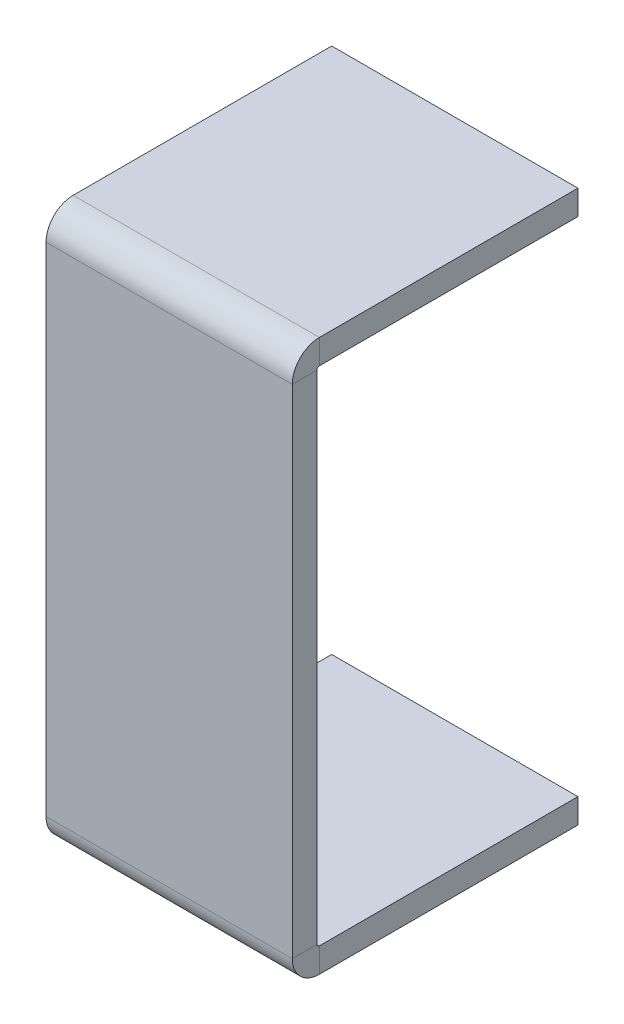
ISO-10303-21;
HEADER;
FILE_DESCRIPTION(('STEP AP214'),'2;1');
FILE_NAME('part.step','',(''),(''),'','','');
FILE_SCHEMA(('AUTOMOTIVE_DESIGN { 1 0 10303 214 1 1 1 1 }'));
ENDSEC;
DATA;
#1=APPLICATION_CONTEXT('core data for automotive mechanical design processes');
#2=APPLICATION_PROTOCOL_DEFINITION('international standard','automotive_design',2000,#1);
#3=PRODUCT_CONTEXT('',#1,'mechanical');
#4=PRODUCT('Part','Part','',(#3));
#5=PRODUCT_RELATED_PRODUCT_CATEGORY('part','',(#4));
#6=PRODUCT_DEFINITION_FORMATION('','',#4);
#7=PRODUCT_DEFINITION_CONTEXT('part definition',#1,'design');
#8=PRODUCT_DEFINITION('design','',#6,#7);
#9=PRODUCT_DEFINITION_SHAPE('','',#8);
#10=(LENGTH_UNIT() NAMED_UNIT(*) SI_UNIT(.MILLI.,.METRE.));
#11=(NAMED_UNIT(*) PLANE_ANGLE_UNIT() SI_UNIT($,.RADIAN.));
#12=(NAMED_UNIT(*) SI_UNIT($,.STERADIAN.) SOLID_ANGLE_UNIT());
#13=UNCERTAINTY_MEASURE_WITH_UNIT(LENGTH_MEASURE(1.E-05),#10,'distance_accuracy_value','');
#14=(GEOMETRIC_REPRESENTATION_CONTEXT(3) GLOBAL_UNCERTAINTY_ASSIGNED_CONTEXT((#13)) GLOBAL_UNIT_ASSIGNED_CONTEXT((#10,
#11,#12)) REPRESENTATION_CONTEXT('',''));
#15=CARTESIAN_POINT('',(0.,0.,0.));
#16=DIRECTION('',(0.,0.,1.));
#17=DIRECTION('',(1.,0.,0.));
#18=AXIS2_PLACEMENT_3D('',#15,#16,#17);
#19=CARTESIAN_POINT('',(0.,0.,-10.));
#20=DIRECTION('',(0.,0.,1.));
#21=DIRECTION('',(1.,0.,0.));
#22=AXIS2_PLACEMENT_3D('',#19,#20,#21);
#23=PLANE('',#22);
#24=DIRECTION('',(-1.,0.,0.));
#25=VECTOR('',#24,1.);
#26=CARTESIAN_POINT('',(-50.,-101.,-10.));
#27=LINE('',#26,#25);
#28=CARTESIAN_POINT('',(-50.,-101.,-10.));
#29=VERTEX_POINT('',#28);
#30=CARTESIAN_POINT('',(50.,-101.,-10.));
#31=VERTEX_POINT('',#30);
#32=EDGE_CURVE('E225',#29,#31,#27,.F.);
#33=ORIENTED_EDGE('',*,*,#32,.F.);
#34=DIRECTION('',(0.,-1.,0.));
#35=VECTOR('',#34,1.);
#36=CARTESIAN_POINT('',(-50.,112.,-10.));
#37=LINE('',#36,#35);
#38=CARTESIAN_POINT('',(-50.,101.,-10.));
#39=VERTEX_POINT('',#38);
#40=EDGE_CURVE('E13',#39,#29,#37,.T.);
#41=ORIENTED_EDGE('',*,*,#40,.F.);
#42=DIRECTION('',(1.,0.,0.));
#43=VECTOR('',#42,1.);
#44=CARTESIAN_POINT('',(50.,101.,-10.));
#45=LINE('',#44,#43);
#46=CARTESIAN_POINT('',(50.,101.,-10.));
#47=VERTEX_POINT('',#46);
#48=EDGE_CURVE('E277',#47,#39,#45,.F.);
#49=ORIENTED_EDGE('',*,*,#48,.F.);
#50=DIRECTION('',(0.,1.,0.));
#51=VECTOR('',#50,1.);
#52=CARTESIAN_POINT('',(50.,112.,-10.));
#53=LINE('',#52,#51);
#54=EDGE_CURVE('E88',#31,#47,#53,.T.);
#55=ORIENTED_EDGE('',*,*,#54,.F.);
#56=EDGE_LOOP('',(#33,#41,#49,#55));
#57=FACE_BOUND('',#56,.T.);
#58=ADVANCED_FACE('F79',(#57),#23,.F.);
#59=CARTESIAN_POINT('',(0.,0.,0.));
#60=DIRECTION('',(0.,0.,1.));
#61=DIRECTION('',(1.,0.,0.));
#62=AXIS2_PLACEMENT_3D('',#59,#60,#61);
#63=PLANE('',#62);
#64=DIRECTION('',(0.,-1.,0.));
#65=VECTOR('',#64,1.);
#66=CARTESIAN_POINT('',(-50.,112.,0.));
#67=LINE('',#66,#65);
#68=CARTESIAN_POINT('',(-50.,101.,0.));
#69=VERTEX_POINT('',#68);
#70=CARTESIAN_POINT('',(-50.,-101.,0.));
#71=VERTEX_POINT('',#70);
#72=EDGE_CURVE('E83',#69,#71,#67,.T.);
#73=ORIENTED_EDGE('',*,*,#72,.T.);
#74=DIRECTION('',(-1.,0.,0.));
#75=VECTOR('',#74,1.);
#76=CARTESIAN_POINT('',(-50.,-101.,0.));
#77=LINE('',#76,#75);
#78=CARTESIAN_POINT('',(50.,-101.,0.));
#79=VERTEX_POINT('',#78);
#80=EDGE_CURVE('E214',#71,#79,#77,.F.);
#81=ORIENTED_EDGE('',*,*,#80,.T.);
#82=DIRECTION('',(0.,1.,0.));
#83=VECTOR('',#82,1.);
#84=CARTESIAN_POINT('',(50.,112.,0.));
#85=LINE('',#84,#83);
#86=CARTESIAN_POINT('',(50.,101.,0.));
#87=VERTEX_POINT('',#86);
#88=EDGE_CURVE('E283',#79,#87,#85,.T.);
#89=ORIENTED_EDGE('',*,*,#88,.T.);
#90=DIRECTION('',(1.,0.,0.));
#91=VECTOR('',#90,1.);
#92=CARTESIAN_POINT('',(50.,101.,0.));
#93=LINE('',#92,#91);
#94=EDGE_CURVE('E266',#87,#69,#93,.F.);
#95=ORIENTED_EDGE('',*,*,#94,.T.);
#96=EDGE_LOOP('',(#73,#81,#89,#95));
#97=FACE_BOUND('',#96,.T.);
#98=ADVANCED_FACE('F292',(#97),#63,.T.);
#99=CARTESIAN_POINT('',(-50.,112.,-10.));
#100=DIRECTION('',(-1.,0.,0.));
#101=DIRECTION('',(0.,-1.,0.));
#102=AXIS2_PLACEMENT_3D('',#99,#100,#101);
#103=PLANE('',#102);
#104=ORIENTED_EDGE('',*,*,#40,.T.);
#105=DIRECTION('',(0.,0.,1.));
#106=VECTOR('',#105,1.);
#107=CARTESIAN_POINT('',(-50.,-101.,-10.));
#108=LINE('',#107,#106);
#109=EDGE_CURVE('E219',#29,#71,#108,.T.);
#110=ORIENTED_EDGE('',*,*,#109,.T.);
#111=ORIENTED_EDGE('',*,*,#72,.F.);
#112=DIRECTION('',(0.,0.,1.));
#113=VECTOR('',#112,1.);
#114=CARTESIAN_POINT('',(-50.,101.,-10.));
#115=LINE('',#114,#113);
#116=EDGE_CURVE('E281',#39,#69,#115,.T.);
#117=ORIENTED_EDGE('',*,*,#116,.F.);
#118=EDGE_LOOP('',(#104,#110,#111,#117));
#119=FACE_BOUND('',#118,.T.);
#120=ADVANCED_FACE('F295',(#119),#103,.T.);
#121=CARTESIAN_POINT('',(50.,112.,-10.));
#122=DIRECTION('',(1.,0.,0.));
#123=DIRECTION('',(0.,1.,0.));
#124=AXIS2_PLACEMENT_3D('',#121,#122,#123);
#125=PLANE('',#124);
#126=DIRECTION('',(0.,0.,1.));
#127=VECTOR('',#126,1.);
#128=CARTESIAN_POINT('',(50.,-101.,-10.));
#129=LINE('',#128,#127);
#130=EDGE_CURVE('E229',#31,#79,#129,.T.);
#131=ORIENTED_EDGE('',*,*,#130,.F.);
#132=ORIENTED_EDGE('',*,*,#54,.T.);
#133=DIRECTION('',(0.,0.,1.));
#134=VECTOR('',#133,1.);
#135=CARTESIAN_POINT('',(50.,101.,-10.));
#136=LINE('',#135,#134);
#137=EDGE_CURVE('E271',#47,#87,#136,.T.);
#138=ORIENTED_EDGE('',*,*,#137,.T.);
#139=ORIENTED_EDGE('',*,*,#88,.F.);
#140=EDGE_LOOP('',(#131,#132,#138,#139));
#141=FACE_BOUND('',#140,.T.);
#142=ADVANCED_FACE('F81',(#141),#125,.T.);
#143=CARTESIAN_POINT('',(-50.,101.,-11.));
#144=DIRECTION('',(-1.,0.,0.));
#145=DIRECTION('',(0.,0.,1.));
#146=AXIS2_PLACEMENT_3D('',#143,#144,#145);
#147=PLANE('',#146);
#148=DIRECTION('',(0.,1.,0.));
#149=VECTOR('',#148,1.);
#150=CARTESIAN_POINT('',(-50.,112.,-11.));
#151=LINE('',#150,#149);
#152=CARTESIAN_POINT('',(-50.,102.,-11.));
#153=VERTEX_POINT('',#152);
#154=CARTESIAN_POINT('',(-50.,112.,-11.));
#155=VERTEX_POINT('',#154);
#156=EDGE_CURVE('E231',#153,#155,#151,.T.);
#157=ORIENTED_EDGE('',*,*,#156,.F.);
#158=CARTESIAN_POINT('',(-50.,101.,-11.));
#159=DIRECTION('',(1.,0.,0.));
#160=DIRECTION('',(0.,0.,-1.));
#161=AXIS2_PLACEMENT_3D('',#158,#159,#160);
#162=CIRCLE('',#161,1.);
#163=EDGE_CURVE('E274',#39,#153,#162,.F.);
#164=ORIENTED_EDGE('',*,*,#163,.F.);
#165=ORIENTED_EDGE('',*,*,#116,.T.);
#166=CARTESIAN_POINT('',(-50.,101.,-11.));
#167=DIRECTION('',(1.,0.,0.));
#168=DIRECTION('',(0.,0.,-1.));
#169=AXIS2_PLACEMENT_3D('',#166,#167,#168);
#170=CIRCLE('',#169,11.);
#171=EDGE_CURVE('E96',#69,#155,#170,.F.);
#172=ORIENTED_EDGE('',*,*,#171,.T.);
#173=EDGE_LOOP('',(#157,#164,#165,#172));
#174=FACE_BOUND('',#173,.T.);
#175=ADVANCED_FACE('F341',(#174),#147,.T.);
#176=CARTESIAN_POINT('',(50.,101.,-11.));
#177=DIRECTION('',(-1.,0.,0.));
#178=DIRECTION('',(0.,0.,1.));
#179=AXIS2_PLACEMENT_3D('',#176,#177,#178);
#180=PLANE('',#179);
#181=CARTESIAN_POINT('',(50.,101.,-11.));
#182=DIRECTION('',(1.,0.,0.));
#183=DIRECTION('',(0.,0.,-1.));
#184=AXIS2_PLACEMENT_3D('',#181,#182,#183);
#185=CIRCLE('',#184,1.);
#186=CARTESIAN_POINT('',(50.,102.,-11.));
#187=VERTEX_POINT('',#186);
#188=EDGE_CURVE('E236',#187,#47,#185,.T.);
#189=ORIENTED_EDGE('',*,*,#188,.F.);
#190=DIRECTION('',(0.,1.,0.));
#191=VECTOR('',#190,1.);
#192=CARTESIAN_POINT('',(50.,102.,-11.));
#193=LINE('',#192,#191);
#194=CARTESIAN_POINT('',(50.,112.,-11.));
#195=VERTEX_POINT('',#194);
#196=EDGE_CURVE('E259',#187,#195,#193,.T.);
#197=ORIENTED_EDGE('',*,*,#196,.T.);
#198=CARTESIAN_POINT('',(50.,101.,-11.));
#199=DIRECTION('',(1.,0.,0.));
#200=DIRECTION('',(0.,0.,-1.));
#201=AXIS2_PLACEMENT_3D('',#198,#199,#200);
#202=CIRCLE('',#201,11.);
#203=EDGE_CURVE('E269',#195,#87,#202,.T.);
#204=ORIENTED_EDGE('',*,*,#203,.T.);
#205=ORIENTED_EDGE('',*,*,#137,.F.);
#206=EDGE_LOOP('',(#189,#197,#204,#205));
#207=FACE_BOUND('',#206,.T.);
#208=ADVANCED_FACE('F335',(#207),#180,.F.);
#209=CARTESIAN_POINT('',(50.,101.,-11.));
#210=DIRECTION('',(1.,0.,0.));
#211=DIRECTION('',(0.,1.,0.));
#212=AXIS2_PLACEMENT_3D('',#209,#210,#211);
#213=CYLINDRICAL_SURFACE('',#212,11.);
#214=ORIENTED_EDGE('',*,*,#94,.F.);
#215=ORIENTED_EDGE('',*,*,#203,.F.);
#216=DIRECTION('',(1.,0.,0.));
#217=VECTOR('',#216,1.);
#218=CARTESIAN_POINT('',(0.,112.,-11.));
#219=LINE('',#218,#217);
#220=EDGE_CURVE('E256',#155,#195,#219,.T.);
#221=ORIENTED_EDGE('',*,*,#220,.F.);
#222=ORIENTED_EDGE('',*,*,#171,.F.);
#223=EDGE_LOOP('',(#214,#215,#221,#222));
#224=FACE_BOUND('',#223,.T.);
#225=ADVANCED_FACE('F349',(#224),#213,.T.);
#226=CARTESIAN_POINT('',(50.,101.,-11.));
#227=DIRECTION('',(1.,0.,0.));
#228=DIRECTION('',(0.,1.,0.));
#229=AXIS2_PLACEMENT_3D('',#226,#227,#228);
#230=CYLINDRICAL_SURFACE('',#229,1.);
#231=ORIENTED_EDGE('',*,*,#48,.T.);
#232=ORIENTED_EDGE('',*,*,#163,.T.);
#233=DIRECTION('',(-1.,0.,0.));
#234=VECTOR('',#233,1.);
#235=CARTESIAN_POINT('',(-50.,102.,-11.));
#236=LINE('',#235,#234);
#237=EDGE_CURVE('E262',#153,#187,#236,.F.);
#238=ORIENTED_EDGE('',*,*,#237,.T.);
#239=ORIENTED_EDGE('',*,*,#188,.T.);
#240=EDGE_LOOP('',(#231,#232,#238,#239));
#241=FACE_BOUND('',#240,.T.);
#242=ADVANCED_FACE('F352',(#241),#230,.F.);
#243=CARTESIAN_POINT('',(50.,112.,-9.99999999999997));
#244=DIRECTION('',(1.,0.,0.));
#245=DIRECTION('',(0.,0.,-1.));
#246=AXIS2_PLACEMENT_3D('',#243,#244,#245);
#247=PLANE('',#246);
#248=DIRECTION('',(0.,0.,1.));
#249=VECTOR('',#248,1.);
#250=CARTESIAN_POINT('',(50.,112.,-9.99999999999997));
#251=LINE('',#250,#249);
#252=CARTESIAN_POINT('',(50.,112.,-116.));
#253=VERTEX_POINT('',#252);
#254=EDGE_CURVE('E240',#253,#195,#251,.T.);
#255=ORIENTED_EDGE('',*,*,#254,.T.);
#256=ORIENTED_EDGE('',*,*,#196,.F.);
#257=DIRECTION('',(0.,0.,-1.));
#258=VECTOR('',#257,1.);
#259=CARTESIAN_POINT('',(50.,102.,3.95909720102178E-13));
#260=LINE('',#259,#258);
#261=CARTESIAN_POINT('',(50.,102.,-116.));
#262=VERTEX_POINT('',#261);
#263=EDGE_CURVE('E248',#262,#187,#260,.F.);
#264=ORIENTED_EDGE('',*,*,#263,.F.);
#265=DIRECTION('',(0.,-1.,0.));
#266=VECTOR('',#265,1.);
#267=CARTESIAN_POINT('',(50.,112.,-116.));
#268=LINE('',#267,#266);
#269=EDGE_CURVE('E234',#253,#262,#268,.T.);
#270=ORIENTED_EDGE('',*,*,#269,.F.);
#271=EDGE_LOOP('',(#255,#256,#264,#270));
#272=FACE_BOUND('',#271,.T.);
#273=ADVANCED_FACE('F355',(#272),#247,.T.);
#274=CARTESIAN_POINT('',(-50.,112.,-116.));
#275=DIRECTION('',(-1.,0.,0.));
#276=DIRECTION('',(0.,0.,1.));
#277=AXIS2_PLACEMENT_3D('',#274,#275,#276);
#278=PLANE('',#277);
#279=DIRECTION('',(0.,0.,1.));
#280=VECTOR('',#279,1.);
#281=CARTESIAN_POINT('',(-50.,102.,3.95909720102178E-13));
#282=LINE('',#281,#280);
#283=CARTESIAN_POINT('',(-50.,102.,-116.));
#284=VERTEX_POINT('',#283);
#285=EDGE_CURVE('E254',#153,#284,#282,.F.);
#286=ORIENTED_EDGE('',*,*,#285,.F.);
#287=ORIENTED_EDGE('',*,*,#156,.T.);
#288=DIRECTION('',(0.,0.,-1.));
#289=VECTOR('',#288,1.);
#290=CARTESIAN_POINT('',(-50.,112.,-116.));
#291=LINE('',#290,#289);
#292=CARTESIAN_POINT('',(-50.,112.,-116.));
#293=VERTEX_POINT('',#292);
#294=EDGE_CURVE('E246',#155,#293,#291,.T.);
#295=ORIENTED_EDGE('',*,*,#294,.T.);
#296=DIRECTION('',(0.,-1.,0.));
#297=VECTOR('',#296,1.);
#298=CARTESIAN_POINT('',(-50.,112.,-116.));
#299=LINE('',#298,#297);
#300=EDGE_CURVE('E237',#293,#284,#299,.T.);
#301=ORIENTED_EDGE('',*,*,#300,.T.);
#302=EDGE_LOOP('',(#286,#287,#295,#301));
#303=FACE_BOUND('',#302,.T.);
#304=ADVANCED_FACE('F359',(#303),#278,.T.);
#305=CARTESIAN_POINT('',(0.,112.,4.3082453349061E-13));
#306=DIRECTION('',(0.,1.,0.));
#307=DIRECTION('',(0.,0.,1.));
#308=AXIS2_PLACEMENT_3D('',#305,#306,#307);
#309=PLANE('',#308);
#310=ORIENTED_EDGE('',*,*,#294,.F.);
#311=ORIENTED_EDGE('',*,*,#220,.T.);
#312=ORIENTED_EDGE('',*,*,#254,.F.);
#313=DIRECTION('',(1.,0.,0.));
#314=VECTOR('',#313,1.);
#315=CARTESIAN_POINT('',(50.,112.,-116.));
#316=LINE('',#315,#314);
#317=EDGE_CURVE('E243',#293,#253,#316,.T.);
#318=ORIENTED_EDGE('',*,*,#317,.F.);
#319=EDGE_LOOP('',(#310,#311,#312,#318));
#320=FACE_BOUND('',#319,.T.);
#321=ADVANCED_FACE('F362',(#320),#309,.T.);
#322=CARTESIAN_POINT('',(0.,102.,3.95909720102178E-13));
#323=DIRECTION('',(0.,1.,0.));
#324=DIRECTION('',(0.,0.,1.));
#325=AXIS2_PLACEMENT_3D('',#322,#323,#324);
#326=PLANE('',#325);
#327=ORIENTED_EDGE('',*,*,#237,.F.);
#328=ORIENTED_EDGE('',*,*,#285,.T.);
#329=DIRECTION('',(-1.,0.,0.));
#330=VECTOR('',#329,1.);
#331=CARTESIAN_POINT('',(0.,102.,-116.));
#332=LINE('',#331,#330);
#333=EDGE_CURVE('E251',#284,#262,#332,.F.);
#334=ORIENTED_EDGE('',*,*,#333,.T.);
#335=ORIENTED_EDGE('',*,*,#263,.T.);
#336=EDGE_LOOP('',(#327,#328,#334,#335));
#337=FACE_BOUND('',#336,.T.);
#338=ADVANCED_FACE('F367',(#337),#326,.F.);
#339=CARTESIAN_POINT('',(50.,112.,-116.));
#340=DIRECTION('',(0.,0.,-1.));
#341=DIRECTION('',(0.,1.,0.));
#342=AXIS2_PLACEMENT_3D('',#339,#340,#341);
#343=PLANE('',#342);
#344=ORIENTED_EDGE('',*,*,#333,.F.);
#345=ORIENTED_EDGE('',*,*,#300,.F.);
#346=ORIENTED_EDGE('',*,*,#317,.T.);
#347=ORIENTED_EDGE('',*,*,#269,.T.);
#348=EDGE_LOOP('',(#344,#345,#346,#347));
#349=FACE_BOUND('',#348,.T.);
#350=ADVANCED_FACE('F364',(#349),#343,.T.);
#351=CARTESIAN_POINT('',(50.,-101.,-11.));
#352=DIRECTION('',(1.,0.,0.));
#353=DIRECTION('',(0.,0.,-1.));
#354=AXIS2_PLACEMENT_3D('',#351,#352,#353);
#355=PLANE('',#354);
#356=DIRECTION('',(0.,-1.,0.));
#357=VECTOR('',#356,1.);
#358=CARTESIAN_POINT('',(50.,-112.,-11.));
#359=LINE('',#358,#357);
#360=CARTESIAN_POINT('',(50.,-102.,-11.));
#361=VERTEX_POINT('',#360);
#362=CARTESIAN_POINT('',(50.,-112.,-11.));
#363=VERTEX_POINT('',#362);
#364=EDGE_CURVE('E211',#361,#363,#359,.T.);
#365=ORIENTED_EDGE('',*,*,#364,.F.);
#366=CARTESIAN_POINT('',(50.,-101.,-11.));
#367=DIRECTION('',(-1.,0.,0.));
#368=DIRECTION('',(0.,0.,1.));
#369=AXIS2_PLACEMENT_3D('',#366,#367,#368);
#370=CIRCLE('',#369,1.);
#371=EDGE_CURVE('E222',#31,#361,#370,.F.);
#372=ORIENTED_EDGE('',*,*,#371,.F.);
#373=ORIENTED_EDGE('',*,*,#130,.T.);
#374=CARTESIAN_POINT('',(50.,-101.,-11.));
#375=DIRECTION('',(-1.,0.,0.));
#376=DIRECTION('',(0.,0.,1.));
#377=AXIS2_PLACEMENT_3D('',#374,#375,#376);
#378=CIRCLE('',#377,11.);
#379=EDGE_CURVE('E104',#79,#363,#378,.F.);
#380=ORIENTED_EDGE('',*,*,#379,.T.);
#381=EDGE_LOOP('',(#365,#372,#373,#380));
#382=FACE_BOUND('',#381,.T.);
#383=ADVANCED_FACE('F311',(#382),#355,.T.);
#384=CARTESIAN_POINT('',(-50.,-101.,-11.));
#385=DIRECTION('',(1.,0.,0.));
#386=DIRECTION('',(0.,0.,-1.));
#387=AXIS2_PLACEMENT_3D('',#384,#385,#386);
#388=PLANE('',#387);
#389=CARTESIAN_POINT('',(-50.,-101.,-11.));
#390=DIRECTION('',(-1.,0.,0.));
#391=DIRECTION('',(0.,0.,1.));
#392=AXIS2_PLACEMENT_3D('',#389,#390,#391);
#393=CIRCLE('',#392,1.);
#394=CARTESIAN_POINT('',(-50.,-102.,-11.));
#395=VERTEX_POINT('',#394);
#396=EDGE_CURVE('E181',#395,#29,#393,.T.);
#397=ORIENTED_EDGE('',*,*,#396,.F.);
#398=DIRECTION('',(0.,-1.,0.));
#399=VECTOR('',#398,1.);
#400=CARTESIAN_POINT('',(-50.,-102.,-11.));
#401=LINE('',#400,#399);
#402=CARTESIAN_POINT('',(-50.,-112.,-11.));
#403=VERTEX_POINT('',#402);
#404=EDGE_CURVE('E206',#395,#403,#401,.T.);
#405=ORIENTED_EDGE('',*,*,#404,.T.);
#406=CARTESIAN_POINT('',(-50.,-101.,-11.));
#407=DIRECTION('',(-1.,0.,0.));
#408=DIRECTION('',(0.,0.,1.));
#409=AXIS2_PLACEMENT_3D('',#406,#407,#408);
#410=CIRCLE('',#409,11.);
#411=EDGE_CURVE('E217',#403,#71,#410,.T.);
#412=ORIENTED_EDGE('',*,*,#411,.T.);
#413=ORIENTED_EDGE('',*,*,#109,.F.);
#414=EDGE_LOOP('',(#397,#405,#412,#413));
#415=FACE_BOUND('',#414,.T.);
#416=ADVANCED_FACE('F299',(#415),#388,.F.);
#417=CARTESIAN_POINT('',(-50.,-101.,-11.));
#418=DIRECTION('',(-1.,0.,0.));
#419=DIRECTION('',(0.,-1.,0.));
#420=AXIS2_PLACEMENT_3D('',#417,#418,#419);
#421=CYLINDRICAL_SURFACE('',#420,11.);
#422=ORIENTED_EDGE('',*,*,#80,.F.);
#423=ORIENTED_EDGE('',*,*,#411,.F.);
#424=DIRECTION('',(-1.,0.,0.));
#425=VECTOR('',#424,1.);
#426=CARTESIAN_POINT('',(50.,-112.,-11.));
#427=LINE('',#426,#425);
#428=EDGE_CURVE('E190',#403,#363,#427,.F.);
#429=ORIENTED_EDGE('',*,*,#428,.T.);
#430=ORIENTED_EDGE('',*,*,#379,.F.);
#431=EDGE_LOOP('',(#422,#423,#429,#430));
#432=FACE_BOUND('',#431,.T.);
#433=ADVANCED_FACE('F324',(#432),#421,.T.);
#434=CARTESIAN_POINT('',(-50.,-101.,-11.));
#435=DIRECTION('',(-1.,0.,0.));
#436=DIRECTION('',(0.,-1.,0.));
#437=AXIS2_PLACEMENT_3D('',#434,#435,#436);
#438=CYLINDRICAL_SURFACE('',#437,1.);
#439=ORIENTED_EDGE('',*,*,#32,.T.);
#440=ORIENTED_EDGE('',*,*,#371,.T.);
#441=DIRECTION('',(-1.,0.,0.));
#442=VECTOR('',#441,1.);
#443=CARTESIAN_POINT('',(50.,-102.,-11.));
#444=LINE('',#443,#442);
#445=EDGE_CURVE('E209',#361,#395,#444,.T.);
#446=ORIENTED_EDGE('',*,*,#445,.T.);
#447=ORIENTED_EDGE('',*,*,#396,.T.);
#448=EDGE_LOOP('',(#439,#440,#446,#447));
#449=FACE_BOUND('',#448,.T.);
#450=ADVANCED_FACE('F302',(#449),#438,.F.);
#451=CARTESIAN_POINT('',(50.,-112.,-9.99999999999997));
#452=DIRECTION('',(1.,0.,0.));
#453=DIRECTION('',(0.,0.,-1.));
#454=AXIS2_PLACEMENT_3D('',#451,#452,#453);
#455=PLANE('',#454);
#456=DIRECTION('',(0.,0.,-1.));
#457=VECTOR('',#456,1.);
#458=CARTESIAN_POINT('',(50.,-102.,3.95909720102178E-13));
#459=LINE('',#458,#457);
#460=CARTESIAN_POINT('',(50.,-102.,-116.));
#461=VERTEX_POINT('',#460);
#462=EDGE_CURVE('E203',#361,#461,#459,.T.);
#463=ORIENTED_EDGE('',*,*,#462,.F.);
#464=ORIENTED_EDGE('',*,*,#364,.T.);
#465=DIRECTION('',(0.,0.,1.));
#466=VECTOR('',#465,1.);
#467=CARTESIAN_POINT('',(50.,-112.,-9.99999999999997));
#468=LINE('',#467,#466);
#469=CARTESIAN_POINT('',(50.,-112.,-116.));
#470=VERTEX_POINT('',#469);
#471=EDGE_CURVE('E195',#363,#470,#468,.F.);
#472=ORIENTED_EDGE('',*,*,#471,.T.);
#473=DIRECTION('',(0.,1.,0.));
#474=VECTOR('',#473,1.);
#475=CARTESIAN_POINT('',(50.,-112.,-116.));
#476=LINE('',#475,#474);
#477=EDGE_CURVE('E182',#470,#461,#476,.T.);
#478=ORIENTED_EDGE('',*,*,#477,.T.);
#479=EDGE_LOOP('',(#463,#464,#472,#478));
#480=FACE_BOUND('',#479,.T.);
#481=ADVANCED_FACE('F316',(#480),#455,.T.);
#482=CARTESIAN_POINT('',(-50.,-112.,-116.));
#483=DIRECTION('',(-1.,0.,0.));
#484=DIRECTION('',(0.,0.,1.));
#485=AXIS2_PLACEMENT_3D('',#482,#483,#484);
#486=PLANE('',#485);
#487=DIRECTION('',(0.,0.,-1.));
#488=VECTOR('',#487,1.);
#489=CARTESIAN_POINT('',(-50.,-112.,-116.));
#490=LINE('',#489,#488);
#491=CARTESIAN_POINT('',(-50.,-112.,-116.));
#492=VERTEX_POINT('',#491);
#493=EDGE_CURVE('E174',#492,#403,#490,.F.);
#494=ORIENTED_EDGE('',*,*,#493,.T.);
#495=ORIENTED_EDGE('',*,*,#404,.F.);
#496=DIRECTION('',(0.,0.,1.));
#497=VECTOR('',#496,1.);
#498=CARTESIAN_POINT('',(-50.,-102.,3.95909720102178E-13));
#499=LINE('',#498,#497);
#500=CARTESIAN_POINT('',(-50.,-102.,-116.));
#501=VERTEX_POINT('',#500);
#502=EDGE_CURVE('E176',#501,#395,#499,.T.);
#503=ORIENTED_EDGE('',*,*,#502,.F.);
#504=DIRECTION('',(0.,1.,0.));
#505=VECTOR('',#504,1.);
#506=CARTESIAN_POINT('',(-50.,-112.,-116.));
#507=LINE('',#506,#505);
#508=EDGE_CURVE('E170',#492,#501,#507,.T.);
#509=ORIENTED_EDGE('',*,*,#508,.F.);
#510=EDGE_LOOP('',(#494,#495,#503,#509));
#511=FACE_BOUND('',#510,.T.);
#512=ADVANCED_FACE('F172',(#511),#486,.T.);
#513=CARTESIAN_POINT('',(0.,-112.,4.30824533490609E-13));
#514=DIRECTION('',(0.,1.,0.));
#515=DIRECTION('',(0.,0.,1.));
#516=AXIS2_PLACEMENT_3D('',#513,#514,#515);
#517=PLANE('',#516);
#518=ORIENTED_EDGE('',*,*,#428,.F.);
#519=ORIENTED_EDGE('',*,*,#493,.F.);
#520=DIRECTION('',(1.,0.,0.));
#521=VECTOR('',#520,1.);
#522=CARTESIAN_POINT('',(50.,-112.,-116.));
#523=LINE('',#522,#521);
#524=EDGE_CURVE('E189',#470,#492,#523,.F.);
#525=ORIENTED_EDGE('',*,*,#524,.F.);
#526=ORIENTED_EDGE('',*,*,#471,.F.);
#527=EDGE_LOOP('',(#518,#519,#525,#526));
#528=FACE_BOUND('',#527,.T.);
#529=ADVANCED_FACE('F187',(#528),#517,.F.);
#530=CARTESIAN_POINT('',(0.,-102.,3.95909720102178E-13));
#531=DIRECTION('',(0.,1.,0.));
#532=DIRECTION('',(0.,0.,1.));
#533=AXIS2_PLACEMENT_3D('',#530,#531,#532);
#534=PLANE('',#533);
#535=ORIENTED_EDGE('',*,*,#502,.T.);
#536=ORIENTED_EDGE('',*,*,#445,.F.);
#537=ORIENTED_EDGE('',*,*,#462,.T.);
#538=DIRECTION('',(-1.,0.,0.));
#539=VECTOR('',#538,1.);
#540=CARTESIAN_POINT('',(0.,-102.,-116.));
#541=LINE('',#540,#539);
#542=EDGE_CURVE('E201',#461,#501,#541,.T.);
#543=ORIENTED_EDGE('',*,*,#542,.T.);
#544=EDGE_LOOP('',(#535,#536,#537,#543));
#545=FACE_BOUND('',#544,.T.);
#546=ADVANCED_FACE('F314',(#545),#534,.T.);
#547=CARTESIAN_POINT('',(50.,-112.,-116.));
#548=DIRECTION('',(0.,0.,-1.));
#549=DIRECTION('',(0.,1.,0.));
#550=AXIS2_PLACEMENT_3D('',#547,#548,#549);
#551=PLANE('',#550);
#552=ORIENTED_EDGE('',*,*,#542,.F.);
#553=ORIENTED_EDGE('',*,*,#477,.F.);
#554=ORIENTED_EDGE('',*,*,#524,.T.);
#555=ORIENTED_EDGE('',*,*,#508,.T.);
#556=EDGE_LOOP('',(#552,#553,#554,#555));
#557=FACE_BOUND('',#556,.T.);
#558=ADVANCED_FACE('F193',(#557),#551,.T.);
#559=CLOSED_SHELL('',(#58,#98,#120,#142,#175,#208,#225,#242,#273,#304,#321,#338,#350,#383,#416,
#433,#450,#481,#512,#529,#546,#558));
#560=MANIFOLD_SOLID_BREP('B2',#559);
#561=ADVANCED_BREP_SHAPE_REPRESENTATION('',(#18,#560),#14);
#562=SHAPE_DEFINITION_REPRESENTATION(#9,#561);
ENDSEC;
END-ISO-10303-21;
